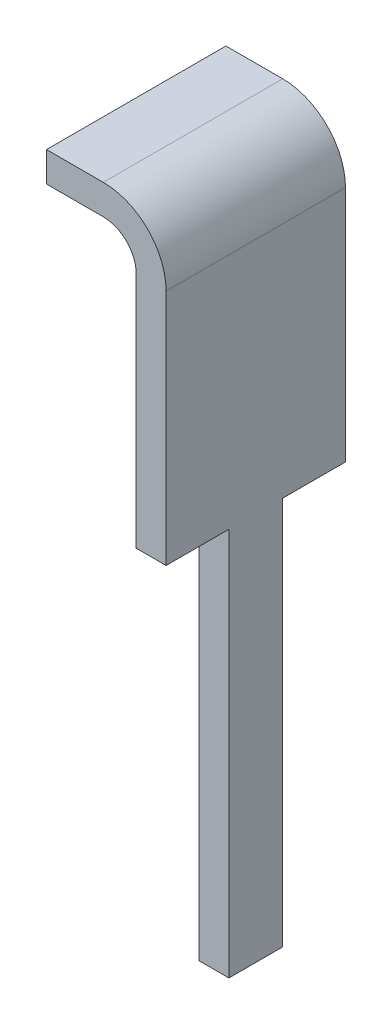
ISO-10303-21;
HEADER;
FILE_DESCRIPTION(('STEP AP214'),'2;1');
FILE_NAME('part.step','',(''),(''),'','','');
FILE_SCHEMA(('AUTOMOTIVE_DESIGN { 1 0 10303 214 1 1 1 1 }'));
ENDSEC;
DATA;
#1=APPLICATION_CONTEXT('core data for automotive mechanical design processes');
#2=APPLICATION_PROTOCOL_DEFINITION('international standard','automotive_design',2000,#1);
#3=PRODUCT_CONTEXT('',#1,'mechanical');
#4=PRODUCT('Part','Part','',(#3));
#5=PRODUCT_RELATED_PRODUCT_CATEGORY('part','',(#4));
#6=PRODUCT_DEFINITION_FORMATION('','',#4);
#7=PRODUCT_DEFINITION_CONTEXT('part definition',#1,'design');
#8=PRODUCT_DEFINITION('design','',#6,#7);
#9=PRODUCT_DEFINITION_SHAPE('','',#8);
#10=(LENGTH_UNIT() NAMED_UNIT(*) SI_UNIT(.MILLI.,.METRE.));
#11=(NAMED_UNIT(*) PLANE_ANGLE_UNIT() SI_UNIT($,.RADIAN.));
#12=(NAMED_UNIT(*) SI_UNIT($,.STERADIAN.) SOLID_ANGLE_UNIT());
#13=UNCERTAINTY_MEASURE_WITH_UNIT(LENGTH_MEASURE(1.E-05),#10,'distance_accuracy_value','');
#14=(GEOMETRIC_REPRESENTATION_CONTEXT(3) GLOBAL_UNCERTAINTY_ASSIGNED_CONTEXT((#13)) GLOBAL_UNIT_ASSIGNED_CONTEXT((#10,
#11,#12)) REPRESENTATION_CONTEXT('',''));
#15=CARTESIAN_POINT('',(0.,0.,0.));
#16=DIRECTION('',(0.,0.,1.));
#17=DIRECTION('',(1.,0.,0.));
#18=AXIS2_PLACEMENT_3D('',#15,#16,#17);
#19=CARTESIAN_POINT('',(0.508,-5.7277,-0.762));
#20=DIRECTION('',(0.,-1.,0.));
#21=DIRECTION('',(0.,0.,-1.));
#22=AXIS2_PLACEMENT_3D('',#19,#20,#21);
#23=PLANE('',#22);
#24=DIRECTION('',(1.,0.,0.));
#25=VECTOR('',#24,1.);
#26=CARTESIAN_POINT('',(0.508,-5.7277,-0.2286));
#27=LINE('',#26,#25);
#28=CARTESIAN_POINT('',(0.508,-5.7277,-0.2286));
#29=VERTEX_POINT('',#28);
#30=CARTESIAN_POINT('',(0.762,-5.7277,-0.2286));
#31=VERTEX_POINT('',#30);
#32=EDGE_CURVE('E203',#29,#31,#27,.T.);
#33=ORIENTED_EDGE('',*,*,#32,.T.);
#34=DIRECTION('',(0.,0.,1.));
#35=VECTOR('',#34,1.);
#36=CARTESIAN_POINT('',(0.762,-5.7277,-0.2286));
#37=LINE('',#36,#35);
#38=CARTESIAN_POINT('',(0.762,-5.7277,0.2286));
#39=VERTEX_POINT('',#38);
#40=EDGE_CURVE('E199',#31,#39,#37,.T.);
#41=ORIENTED_EDGE('',*,*,#40,.T.);
#42=DIRECTION('',(1.,0.,0.));
#43=VECTOR('',#42,1.);
#44=CARTESIAN_POINT('',(0.508,-5.7277,0.2286));
#45=LINE('',#44,#43);
#46=CARTESIAN_POINT('',(0.508,-5.7277,0.2286));
#47=VERTEX_POINT('',#46);
#48=EDGE_CURVE('E11',#47,#39,#45,.T.);
#49=ORIENTED_EDGE('',*,*,#48,.F.);
#50=DIRECTION('',(0.,0.,1.));
#51=VECTOR('',#50,1.);
#52=CARTESIAN_POINT('',(0.508,-5.7277,-0.2286));
#53=LINE('',#52,#51);
#54=EDGE_CURVE('E205',#29,#47,#53,.T.);
#55=ORIENTED_EDGE('',*,*,#54,.F.);
#56=EDGE_LOOP('',(#33,#41,#49,#55));
#57=FACE_BOUND('',#56,.T.);
#58=ADVANCED_FACE('F17',(#57),#23,.T.);
#59=CARTESIAN_POINT('',(0.762,-5.7277,0.2286));
#60=DIRECTION('',(0.,0.,-1.));
#61=DIRECTION('',(0.,-1.,0.));
#62=AXIS2_PLACEMENT_3D('',#59,#60,#61);
#63=PLANE('',#62);
#64=DIRECTION('',(0.,1.,0.));
#65=VECTOR('',#64,1.);
#66=CARTESIAN_POINT('',(0.762,-5.7277,0.2286));
#67=LINE('',#66,#65);
#68=CARTESIAN_POINT('',(0.762,-2.4257,0.2286));
#69=VERTEX_POINT('',#68);
#70=EDGE_CURVE('E204',#39,#69,#67,.T.);
#71=ORIENTED_EDGE('',*,*,#70,.T.);
#72=DIRECTION('',(-1.,0.,0.));
#73=VECTOR('',#72,1.);
#74=CARTESIAN_POINT('',(0.762,-2.4257,0.2286));
#75=LINE('',#74,#73);
#76=CARTESIAN_POINT('',(0.508,-2.4257,0.2286));
#77=VERTEX_POINT('',#76);
#78=EDGE_CURVE('E28',#69,#77,#75,.T.);
#79=ORIENTED_EDGE('',*,*,#78,.T.);
#80=DIRECTION('',(0.,1.,0.));
#81=VECTOR('',#80,1.);
#82=CARTESIAN_POINT('',(0.508,-5.7277,0.2286));
#83=LINE('',#82,#81);
#84=EDGE_CURVE('E209',#47,#77,#83,.T.);
#85=ORIENTED_EDGE('',*,*,#84,.F.);
#86=ORIENTED_EDGE('',*,*,#48,.T.);
#87=EDGE_LOOP('',(#71,#79,#85,#86));
#88=FACE_BOUND('',#87,.T.);
#89=ADVANCED_FACE('F288',(#88),#63,.F.);
#90=CARTESIAN_POINT('',(0.762,-2.4257,0.2286));
#91=DIRECTION('',(0.,1.,0.));
#92=DIRECTION('',(1.,0.,0.));
#93=AXIS2_PLACEMENT_3D('',#90,#91,#92);
#94=PLANE('',#93);
#95=DIRECTION('',(1.,0.,0.));
#96=VECTOR('',#95,1.);
#97=CARTESIAN_POINT('',(0.508,-2.4257,0.762));
#98=LINE('',#97,#96);
#99=CARTESIAN_POINT('',(0.508,-2.4257,0.762));
#100=VERTEX_POINT('',#99);
#101=CARTESIAN_POINT('',(0.762,-2.4257,0.762));
#102=VERTEX_POINT('',#101);
#103=EDGE_CURVE('E178',#100,#102,#98,.T.);
#104=ORIENTED_EDGE('',*,*,#103,.F.);
#105=DIRECTION('',(0.,0.,-1.));
#106=VECTOR('',#105,1.);
#107=CARTESIAN_POINT('',(0.508,-2.4257,0.762));
#108=LINE('',#107,#106);
#109=EDGE_CURVE('E183',#100,#77,#108,.T.);
#110=ORIENTED_EDGE('',*,*,#109,.T.);
#111=ORIENTED_EDGE('',*,*,#78,.F.);
#112=DIRECTION('',(0.,0.,-1.));
#113=VECTOR('',#112,1.);
#114=CARTESIAN_POINT('',(0.762,-2.4257,0.762));
#115=LINE('',#114,#113);
#116=EDGE_CURVE('E237',#102,#69,#115,.T.);
#117=ORIENTED_EDGE('',*,*,#116,.F.);
#118=EDGE_LOOP('',(#104,#110,#111,#117));
#119=FACE_BOUND('',#118,.T.);
#120=ADVANCED_FACE('F281',(#119),#94,.F.);
#121=CARTESIAN_POINT('',(0.,0.,0.762));
#122=DIRECTION('',(0.,0.,1.));
#123=DIRECTION('',(1.,0.,0.));
#124=AXIS2_PLACEMENT_3D('',#121,#122,#123);
#125=PLANE('',#124);
#126=ORIENTED_EDGE('',*,*,#103,.T.);
#127=DIRECTION('',(0.,1.,0.));
#128=VECTOR('',#127,1.);
#129=CARTESIAN_POINT('',(0.762,-2.4257,0.762));
#130=LINE('',#129,#128);
#131=CARTESIAN_POINT('',(0.762,-0.4064,0.762));
#132=VERTEX_POINT('',#131);
#133=EDGE_CURVE('E137',#102,#132,#130,.T.);
#134=ORIENTED_EDGE('',*,*,#133,.T.);
#135=CARTESIAN_POINT('',(0.2286,-0.4064,0.762));
#136=DIRECTION('',(0.,0.,1.));
#137=DIRECTION('',(1.,0.,0.));
#138=AXIS2_PLACEMENT_3D('',#135,#136,#137);
#139=CIRCLE('',#138,0.5334);
#140=CARTESIAN_POINT('',(0.2286,0.127,0.762));
#141=VERTEX_POINT('',#140);
#142=EDGE_CURVE('E42',#132,#141,#139,.T.);
#143=ORIENTED_EDGE('',*,*,#142,.T.);
#144=DIRECTION('',(-1.,0.,0.));
#145=VECTOR('',#144,1.);
#146=CARTESIAN_POINT('',(0.,0.127,0.762));
#147=LINE('',#146,#145);
#148=CARTESIAN_POINT('',(-0.254,0.127,0.762));
#149=VERTEX_POINT('',#148);
#150=EDGE_CURVE('E80',#141,#149,#147,.T.);
#151=ORIENTED_EDGE('',*,*,#150,.T.);
#152=DIRECTION('',(0.,1.,0.));
#153=VECTOR('',#152,1.);
#154=CARTESIAN_POINT('',(-0.254,-0.127,0.762));
#155=LINE('',#154,#153);
#156=CARTESIAN_POINT('',(-0.254,-0.127,0.762));
#157=VERTEX_POINT('',#156);
#158=EDGE_CURVE('E154',#157,#149,#155,.T.);
#159=ORIENTED_EDGE('',*,*,#158,.F.);
#160=DIRECTION('',(1.,0.,0.));
#161=VECTOR('',#160,1.);
#162=CARTESIAN_POINT('',(0.,-0.127,0.762));
#163=LINE('',#162,#161);
#164=CARTESIAN_POINT('',(0.2286,-0.127,0.762));
#165=VERTEX_POINT('',#164);
#166=EDGE_CURVE('E21',#157,#165,#163,.T.);
#167=ORIENTED_EDGE('',*,*,#166,.T.);
#168=CARTESIAN_POINT('',(0.2286,-0.4064,0.762));
#169=DIRECTION('',(0.,0.,-1.));
#170=DIRECTION('',(0.,1.,0.));
#171=AXIS2_PLACEMENT_3D('',#168,#169,#170);
#172=CIRCLE('',#171,0.2794);
#173=CARTESIAN_POINT('',(0.508,-0.4064,0.762));
#174=VERTEX_POINT('',#173);
#175=EDGE_CURVE('E172',#165,#174,#172,.T.);
#176=ORIENTED_EDGE('',*,*,#175,.T.);
#177=DIRECTION('',(0.,-1.,0.));
#178=VECTOR('',#177,1.);
#179=CARTESIAN_POINT('',(0.508,-0.4064,0.762));
#180=LINE('',#179,#178);
#181=EDGE_CURVE('E173',#174,#100,#180,.T.);
#182=ORIENTED_EDGE('',*,*,#181,.T.);
#183=EDGE_LOOP('',(#126,#134,#143,#151,#159,#167,#176,#182));
#184=FACE_BOUND('',#183,.T.);
#185=ADVANCED_FACE('F278',(#184),#125,.T.);
#186=CARTESIAN_POINT('',(0.2286,-0.4064,-0.762));
#187=DIRECTION('',(0.,0.,1.));
#188=DIRECTION('',(1.,0.,0.));
#189=AXIS2_PLACEMENT_3D('',#186,#187,#188);
#190=CYLINDRICAL_SURFACE('',#189,0.5334);
#191=CARTESIAN_POINT('',(0.2286,-0.4064,-0.762));
#192=DIRECTION('',(0.,0.,1.));
#193=DIRECTION('',(1.,0.,0.));
#194=AXIS2_PLACEMENT_3D('',#191,#192,#193);
#195=CIRCLE('',#194,0.5334);
#196=CARTESIAN_POINT('',(0.762,-0.4064,-0.762));
#197=VERTEX_POINT('',#196);
#198=CARTESIAN_POINT('',(0.2286,0.127,-0.762));
#199=VERTEX_POINT('',#198);
#200=EDGE_CURVE('E132',#197,#199,#195,.T.);
#201=ORIENTED_EDGE('',*,*,#200,.T.);
#202=DIRECTION('',(0.,0.,1.));
#203=VECTOR('',#202,1.);
#204=CARTESIAN_POINT('',(0.2286,0.127,-0.762));
#205=LINE('',#204,#203);
#206=EDGE_CURVE('E179',#199,#141,#205,.T.);
#207=ORIENTED_EDGE('',*,*,#206,.T.);
#208=ORIENTED_EDGE('',*,*,#142,.F.);
#209=DIRECTION('',(0.,0.,1.));
#210=VECTOR('',#209,1.);
#211=CARTESIAN_POINT('',(0.762,-0.4064,-0.762));
#212=LINE('',#211,#210);
#213=EDGE_CURVE('E129',#197,#132,#212,.T.);
#214=ORIENTED_EDGE('',*,*,#213,.F.);
#215=EDGE_LOOP('',(#201,#207,#208,#214));
#216=FACE_BOUND('',#215,.T.);
#217=ADVANCED_FACE('F131',(#216),#190,.T.);
#218=CARTESIAN_POINT('',(0.2286,0.127,-0.762));
#219=DIRECTION('',(0.,1.,0.));
#220=DIRECTION('',(1.,0.,0.));
#221=AXIS2_PLACEMENT_3D('',#218,#219,#220);
#222=PLANE('',#221);
#223=DIRECTION('',(-1.,0.,0.));
#224=VECTOR('',#223,1.);
#225=CARTESIAN_POINT('',(0.2286,0.127,-0.762));
#226=LINE('',#225,#224);
#227=CARTESIAN_POINT('',(-0.254,0.127,-0.762));
#228=VERTEX_POINT('',#227);
#229=EDGE_CURVE('E92',#199,#228,#226,.T.);
#230=ORIENTED_EDGE('',*,*,#229,.T.);
#231=DIRECTION('',(0.,0.,-1.));
#232=VECTOR('',#231,1.);
#233=CARTESIAN_POINT('',(-0.254,0.127,0.762));
#234=LINE('',#233,#232);
#235=EDGE_CURVE('E194',#149,#228,#234,.T.);
#236=ORIENTED_EDGE('',*,*,#235,.F.);
#237=ORIENTED_EDGE('',*,*,#150,.F.);
#238=ORIENTED_EDGE('',*,*,#206,.F.);
#239=EDGE_LOOP('',(#230,#236,#237,#238));
#240=FACE_BOUND('',#239,.T.);
#241=ADVANCED_FACE('F19',(#240),#222,.T.);
#242=CARTESIAN_POINT('',(0.,-0.127,-0.762));
#243=DIRECTION('',(0.,-1.,0.));
#244=DIRECTION('',(0.,0.,-1.));
#245=AXIS2_PLACEMENT_3D('',#242,#243,#244);
#246=PLANE('',#245);
#247=DIRECTION('',(1.,0.,0.));
#248=VECTOR('',#247,1.);
#249=CARTESIAN_POINT('',(0.,-0.127,-0.762));
#250=LINE('',#249,#248);
#251=CARTESIAN_POINT('',(-0.254,-0.127,-0.762));
#252=VERTEX_POINT('',#251);
#253=CARTESIAN_POINT('',(0.2286,-0.127,-0.762));
#254=VERTEX_POINT('',#253);
#255=EDGE_CURVE('E167',#252,#254,#250,.T.);
#256=ORIENTED_EDGE('',*,*,#255,.T.);
#257=DIRECTION('',(0.,0.,1.));
#258=VECTOR('',#257,1.);
#259=CARTESIAN_POINT('',(0.2286,-0.127,-0.762));
#260=LINE('',#259,#258);
#261=EDGE_CURVE('E188',#254,#165,#260,.T.);
#262=ORIENTED_EDGE('',*,*,#261,.T.);
#263=ORIENTED_EDGE('',*,*,#166,.F.);
#264=DIRECTION('',(0.,0.,1.));
#265=VECTOR('',#264,1.);
#266=CARTESIAN_POINT('',(-0.254,-0.127,-0.762));
#267=LINE('',#266,#265);
#268=EDGE_CURVE('E163',#252,#157,#267,.T.);
#269=ORIENTED_EDGE('',*,*,#268,.F.);
#270=EDGE_LOOP('',(#256,#262,#263,#269));
#271=FACE_BOUND('',#270,.T.);
#272=ADVANCED_FACE('F276',(#271),#246,.T.);
#273=CARTESIAN_POINT('',(0.2286,-0.4064,-0.762));
#274=DIRECTION('',(0.,0.,1.));
#275=DIRECTION('',(1.,0.,0.));
#276=AXIS2_PLACEMENT_3D('',#273,#274,#275);
#277=CYLINDRICAL_SURFACE('',#276,0.2794);
#278=CARTESIAN_POINT('',(0.2286,-0.4064,-0.762));
#279=DIRECTION('',(0.,0.,-1.));
#280=DIRECTION('',(0.,1.,0.));
#281=AXIS2_PLACEMENT_3D('',#278,#279,#280);
#282=CIRCLE('',#281,0.2794);
#283=CARTESIAN_POINT('',(0.508,-0.4064,-0.762));
#284=VERTEX_POINT('',#283);
#285=EDGE_CURVE('E184',#254,#284,#282,.T.);
#286=ORIENTED_EDGE('',*,*,#285,.T.);
#287=DIRECTION('',(0.,0.,1.));
#288=VECTOR('',#287,1.);
#289=CARTESIAN_POINT('',(0.508,-0.4064,-0.762));
#290=LINE('',#289,#288);
#291=EDGE_CURVE('E169',#284,#174,#290,.T.);
#292=ORIENTED_EDGE('',*,*,#291,.T.);
#293=ORIENTED_EDGE('',*,*,#175,.F.);
#294=ORIENTED_EDGE('',*,*,#261,.F.);
#295=EDGE_LOOP('',(#286,#292,#293,#294));
#296=FACE_BOUND('',#295,.T.);
#297=ADVANCED_FACE('F303',(#296),#277,.F.);
#298=CARTESIAN_POINT('',(0.508,-0.4064,-0.762));
#299=DIRECTION('',(-1.,0.,0.));
#300=DIRECTION('',(0.,0.,1.));
#301=AXIS2_PLACEMENT_3D('',#298,#299,#300);
#302=PLANE('',#301);
#303=DIRECTION('',(0.,1.,0.));
#304=VECTOR('',#303,1.);
#305=CARTESIAN_POINT('',(0.508,-5.7277,-0.2286));
#306=LINE('',#305,#304);
#307=CARTESIAN_POINT('',(0.508,-2.4257,-0.2286));
#308=VERTEX_POINT('',#307);
#309=EDGE_CURVE('E233',#29,#308,#306,.T.);
#310=ORIENTED_EDGE('',*,*,#309,.F.);
#311=ORIENTED_EDGE('',*,*,#54,.T.);
#312=ORIENTED_EDGE('',*,*,#84,.T.);
#313=ORIENTED_EDGE('',*,*,#109,.F.);
#314=ORIENTED_EDGE('',*,*,#181,.F.);
#315=ORIENTED_EDGE('',*,*,#291,.F.);
#316=DIRECTION('',(0.,-1.,0.));
#317=VECTOR('',#316,1.);
#318=CARTESIAN_POINT('',(0.508,-0.4064,-0.762));
#319=LINE('',#318,#317);
#320=CARTESIAN_POINT('',(0.508,-2.4257,-0.762));
#321=VERTEX_POINT('',#320);
#322=EDGE_CURVE('E160',#284,#321,#319,.T.);
#323=ORIENTED_EDGE('',*,*,#322,.T.);
#324=DIRECTION('',(0.,0.,-1.));
#325=VECTOR('',#324,1.);
#326=CARTESIAN_POINT('',(0.508,-2.4257,-0.2286));
#327=LINE('',#326,#325);
#328=EDGE_CURVE('E210',#308,#321,#327,.T.);
#329=ORIENTED_EDGE('',*,*,#328,.F.);
#330=EDGE_LOOP('',(#310,#311,#312,#313,#314,#315,#323,#329));
#331=FACE_BOUND('',#330,.T.);
#332=ADVANCED_FACE('F220',(#331),#302,.T.);
#333=CARTESIAN_POINT('',(0.762,-2.4257,-0.2286));
#334=DIRECTION('',(0.,-1.,0.));
#335=DIRECTION('',(0.,0.,-1.));
#336=AXIS2_PLACEMENT_3D('',#333,#334,#335);
#337=PLANE('',#336);
#338=DIRECTION('',(0.,0.,-1.));
#339=VECTOR('',#338,1.);
#340=CARTESIAN_POINT('',(0.762,-2.4257,-0.2286));
#341=LINE('',#340,#339);
#342=CARTESIAN_POINT('',(0.762,-2.4257,-0.2286));
#343=VERTEX_POINT('',#342);
#344=CARTESIAN_POINT('',(0.762,-2.4257,-0.762));
#345=VERTEX_POINT('',#344);
#346=EDGE_CURVE('E138',#343,#345,#341,.T.);
#347=ORIENTED_EDGE('',*,*,#346,.F.);
#348=DIRECTION('',(-1.,0.,0.));
#349=VECTOR('',#348,1.);
#350=CARTESIAN_POINT('',(0.762,-2.4257,-0.2286));
#351=LINE('',#350,#349);
#352=EDGE_CURVE('E227',#343,#308,#351,.T.);
#353=ORIENTED_EDGE('',*,*,#352,.T.);
#354=ORIENTED_EDGE('',*,*,#328,.T.);
#355=DIRECTION('',(1.,0.,0.));
#356=VECTOR('',#355,1.);
#357=CARTESIAN_POINT('',(0.508,-2.4257,-0.762));
#358=LINE('',#357,#356);
#359=EDGE_CURVE('E153',#321,#345,#358,.T.);
#360=ORIENTED_EDGE('',*,*,#359,.T.);
#361=EDGE_LOOP('',(#347,#353,#354,#360));
#362=FACE_BOUND('',#361,.T.);
#363=ADVANCED_FACE('F225',(#362),#337,.T.);
#364=CARTESIAN_POINT('',(0.762,-5.7277,-0.2286));
#365=DIRECTION('',(0.,0.,-1.));
#366=DIRECTION('',(0.,-1.,0.));
#367=AXIS2_PLACEMENT_3D('',#364,#365,#366);
#368=PLANE('',#367);
#369=DIRECTION('',(0.,1.,0.));
#370=VECTOR('',#369,1.);
#371=CARTESIAN_POINT('',(0.762,-5.7277,-0.2286));
#372=LINE('',#371,#370);
#373=EDGE_CURVE('E146',#31,#343,#372,.T.);
#374=ORIENTED_EDGE('',*,*,#373,.F.);
#375=ORIENTED_EDGE('',*,*,#32,.F.);
#376=ORIENTED_EDGE('',*,*,#309,.T.);
#377=ORIENTED_EDGE('',*,*,#352,.F.);
#378=EDGE_LOOP('',(#374,#375,#376,#377));
#379=FACE_BOUND('',#378,.T.);
#380=ADVANCED_FACE('F312',(#379),#368,.T.);
#381=CARTESIAN_POINT('',(0.762,-5.7277,-0.762));
#382=DIRECTION('',(1.,0.,0.));
#383=DIRECTION('',(0.,1.,0.));
#384=AXIS2_PLACEMENT_3D('',#381,#382,#383);
#385=PLANE('',#384);
#386=ORIENTED_EDGE('',*,*,#373,.T.);
#387=ORIENTED_EDGE('',*,*,#346,.T.);
#388=DIRECTION('',(0.,1.,0.));
#389=VECTOR('',#388,1.);
#390=CARTESIAN_POINT('',(0.762,-2.4257,-0.762));
#391=LINE('',#390,#389);
#392=EDGE_CURVE('E144',#345,#197,#391,.T.);
#393=ORIENTED_EDGE('',*,*,#392,.T.);
#394=ORIENTED_EDGE('',*,*,#213,.T.);
#395=ORIENTED_EDGE('',*,*,#133,.F.);
#396=ORIENTED_EDGE('',*,*,#116,.T.);
#397=ORIENTED_EDGE('',*,*,#70,.F.);
#398=ORIENTED_EDGE('',*,*,#40,.F.);
#399=EDGE_LOOP('',(#386,#387,#393,#394,#395,#396,#397,#398));
#400=FACE_BOUND('',#399,.T.);
#401=ADVANCED_FACE('F149',(#400),#385,.T.);
#402=CARTESIAN_POINT('',(0.,0.,-0.762));
#403=DIRECTION('',(0.,0.,1.));
#404=DIRECTION('',(1.,0.,0.));
#405=AXIS2_PLACEMENT_3D('',#402,#403,#404);
#406=PLANE('',#405);
#407=ORIENTED_EDGE('',*,*,#392,.F.);
#408=ORIENTED_EDGE('',*,*,#359,.F.);
#409=ORIENTED_EDGE('',*,*,#322,.F.);
#410=ORIENTED_EDGE('',*,*,#285,.F.);
#411=ORIENTED_EDGE('',*,*,#255,.F.);
#412=DIRECTION('',(0.,-1.,0.));
#413=VECTOR('',#412,1.);
#414=CARTESIAN_POINT('',(-0.254,0.127,-0.762));
#415=LINE('',#414,#413);
#416=EDGE_CURVE('E198',#228,#252,#415,.T.);
#417=ORIENTED_EDGE('',*,*,#416,.F.);
#418=ORIENTED_EDGE('',*,*,#229,.F.);
#419=ORIENTED_EDGE('',*,*,#200,.F.);
#420=EDGE_LOOP('',(#407,#408,#409,#410,#411,#417,#418,#419));
#421=FACE_BOUND('',#420,.T.);
#422=ADVANCED_FACE('F142',(#421),#406,.F.);
#423=CARTESIAN_POINT('',(-0.254,0.,0.));
#424=DIRECTION('',(-1.,0.,0.));
#425=DIRECTION('',(0.,0.,1.));
#426=AXIS2_PLACEMENT_3D('',#423,#424,#425);
#427=PLANE('',#426);
#428=ORIENTED_EDGE('',*,*,#235,.T.);
#429=ORIENTED_EDGE('',*,*,#416,.T.);
#430=ORIENTED_EDGE('',*,*,#268,.T.);
#431=ORIENTED_EDGE('',*,*,#158,.T.);
#432=EDGE_LOOP('',(#428,#429,#430,#431));
#433=FACE_BOUND('',#432,.T.);
#434=ADVANCED_FACE('F273',(#433),#427,.T.);
#435=CLOSED_SHELL('',(#58,#89,#120,#185,#217,#241,#272,#297,#332,#363,#380,#401,#422,#434));
#436=MANIFOLD_SOLID_BREP('B1',#435);
#437=ADVANCED_BREP_SHAPE_REPRESENTATION('',(#18,#436),#14);
#438=SHAPE_DEFINITION_REPRESENTATION(#9,#437);
ENDSEC;
END-ISO-10303-21;
